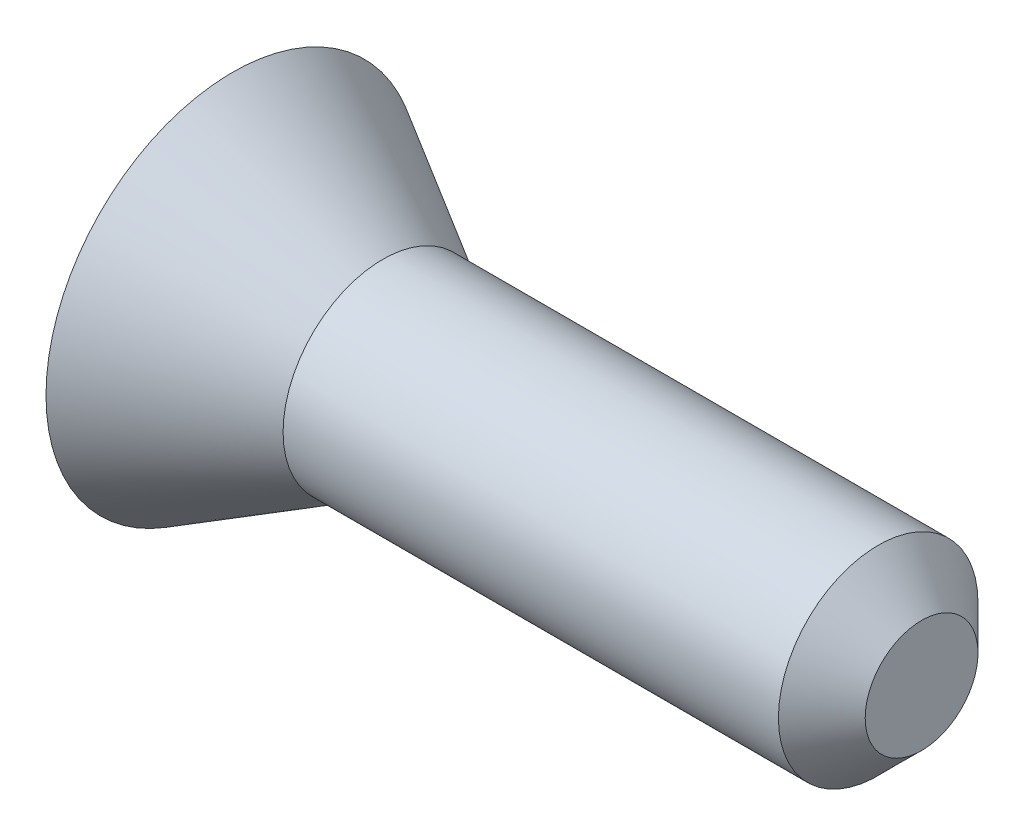
ISO-10303-21;
HEADER;
FILE_DESCRIPTION(('STEP AP214'),'2;1');
FILE_NAME('part.step','',(''),(''),'','','');
FILE_SCHEMA(('AUTOMOTIVE_DESIGN { 1 0 10303 214 1 1 1 1 }'));
ENDSEC;
DATA;
#1=APPLICATION_CONTEXT('core data for automotive mechanical design processes');
#2=APPLICATION_PROTOCOL_DEFINITION('international standard','automotive_design',2000,#1);
#3=PRODUCT_CONTEXT('',#1,'mechanical');
#4=PRODUCT('Part','Part','',(#3));
#5=PRODUCT_RELATED_PRODUCT_CATEGORY('part','',(#4));
#6=PRODUCT_DEFINITION_FORMATION('','',#4);
#7=PRODUCT_DEFINITION_CONTEXT('part definition',#1,'design');
#8=PRODUCT_DEFINITION('design','',#6,#7);
#9=PRODUCT_DEFINITION_SHAPE('','',#8);
#10=(LENGTH_UNIT() NAMED_UNIT(*) SI_UNIT(.MILLI.,.METRE.));
#11=(NAMED_UNIT(*) PLANE_ANGLE_UNIT() SI_UNIT($,.RADIAN.));
#12=(NAMED_UNIT(*) SI_UNIT($,.STERADIAN.) SOLID_ANGLE_UNIT());
#13=UNCERTAINTY_MEASURE_WITH_UNIT(LENGTH_MEASURE(1.E-05),#10,'distance_accuracy_value','');
#14=(GEOMETRIC_REPRESENTATION_CONTEXT(3) GLOBAL_UNCERTAINTY_ASSIGNED_CONTEXT((#13)) GLOBAL_UNIT_ASSIGNED_CONTEXT((#10,
#11,#12)) REPRESENTATION_CONTEXT('',''));
#15=CARTESIAN_POINT('',(0.,0.,0.));
#16=DIRECTION('',(0.,0.,1.));
#17=DIRECTION('',(1.,0.,0.));
#18=AXIS2_PLACEMENT_3D('',#15,#16,#17);
#19=CARTESIAN_POINT('',(0.,-0.3429,1.524));
#20=DIRECTION('',(0.,0.,1.));
#21=DIRECTION('',(1.,0.,0.));
#22=AXIS2_PLACEMENT_3D('',#19,#20,#21);
#23=PLANE('',#22);
#24=DIRECTION('',(1.,0.,0.));
#25=VECTOR('',#24,1.);
#26=CARTESIAN_POINT('',(0.,-0.3429,1.524));
#27=LINE('',#26,#25);
#28=CARTESIAN_POINT('',(1.905,-0.3429,1.524));
#29=VERTEX_POINT('',#28);
#30=CARTESIAN_POINT('',(0.,-0.3429,1.524));
#31=VERTEX_POINT('',#30);
#32=EDGE_CURVE('E117',#29,#31,#27,.F.);
#33=ORIENTED_EDGE('',*,*,#32,.T.);
#34=DIRECTION('',(0.,1.,0.));
#35=VECTOR('',#34,1.);
#36=CARTESIAN_POINT('',(0.,-0.3429,1.524));
#37=LINE('',#36,#35);
#38=CARTESIAN_POINT('',(0.,0.3429,1.524));
#39=VERTEX_POINT('',#38);
#40=EDGE_CURVE('E101',#39,#31,#37,.F.);
#41=ORIENTED_EDGE('',*,*,#40,.F.);
#42=DIRECTION('',(1.,0.,0.));
#43=VECTOR('',#42,1.);
#44=CARTESIAN_POINT('',(0.,0.3429,1.524));
#45=LINE('',#44,#43);
#46=CARTESIAN_POINT('',(1.905,0.3429,1.524));
#47=VERTEX_POINT('',#46);
#48=EDGE_CURVE('E122',#39,#47,#45,.T.);
#49=ORIENTED_EDGE('',*,*,#48,.T.);
#50=DIRECTION('',(0.,1.,0.));
#51=VECTOR('',#50,1.);
#52=CARTESIAN_POINT('',(1.905,-0.3429,1.524));
#53=LINE('',#52,#51);
#54=EDGE_CURVE('E109',#29,#47,#53,.T.);
#55=ORIENTED_EDGE('',*,*,#54,.F.);
#56=EDGE_LOOP('',(#33,#41,#49,#55));
#57=FACE_BOUND('',#56,.T.);
#58=ADVANCED_FACE('F17',(#57),#23,.F.);
#59=CARTESIAN_POINT('',(0.,-0.3429,-1.524));
#60=DIRECTION('',(0.,-1.,0.));
#61=DIRECTION('',(0.,0.,-1.));
#62=AXIS2_PLACEMENT_3D('',#59,#60,#61);
#63=PLANE('',#62);
#64=DIRECTION('',(0.,0.,-1.));
#65=VECTOR('',#64,1.);
#66=CARTESIAN_POINT('',(0.,-0.3429,-1.524));
#67=LINE('',#66,#65);
#68=CARTESIAN_POINT('',(0.,-0.3429,0.3429));
#69=VERTEX_POINT('',#68);
#70=EDGE_CURVE('E126',#31,#69,#67,.T.);
#71=ORIENTED_EDGE('',*,*,#70,.F.);
#72=ORIENTED_EDGE('',*,*,#32,.F.);
#73=DIRECTION('',(0.,0.,-1.));
#74=VECTOR('',#73,1.);
#75=CARTESIAN_POINT('',(1.905,-0.3429,-1.524));
#76=LINE('',#75,#74);
#77=CARTESIAN_POINT('',(1.905,-0.3429,0.3429));
#78=VERTEX_POINT('',#77);
#79=EDGE_CURVE('E106',#78,#29,#76,.F.);
#80=ORIENTED_EDGE('',*,*,#79,.F.);
#81=DIRECTION('',(1.,0.,0.));
#82=VECTOR('',#81,1.);
#83=CARTESIAN_POINT('',(0.,-0.3429,0.3429));
#84=LINE('',#83,#82);
#85=EDGE_CURVE('E201',#78,#69,#84,.F.);
#86=ORIENTED_EDGE('',*,*,#85,.T.);
#87=EDGE_LOOP('',(#71,#72,#80,#86));
#88=FACE_BOUND('',#87,.T.);
#89=ADVANCED_FACE('F125',(#88),#63,.F.);
#90=CARTESIAN_POINT('',(0.,0.3429,1.524));
#91=DIRECTION('',(0.,1.,0.));
#92=DIRECTION('',(0.,0.,1.));
#93=AXIS2_PLACEMENT_3D('',#90,#91,#92);
#94=PLANE('',#93);
#95=DIRECTION('',(0.,0.,1.));
#96=VECTOR('',#95,1.);
#97=CARTESIAN_POINT('',(1.905,0.3429,1.524));
#98=LINE('',#97,#96);
#99=CARTESIAN_POINT('',(1.905,0.3429,0.3429));
#100=VERTEX_POINT('',#99);
#101=EDGE_CURVE('E206',#47,#100,#98,.F.);
#102=ORIENTED_EDGE('',*,*,#101,.F.);
#103=ORIENTED_EDGE('',*,*,#48,.F.);
#104=DIRECTION('',(0.,0.,1.));
#105=VECTOR('',#104,1.);
#106=CARTESIAN_POINT('',(0.,0.3429,1.524));
#107=LINE('',#106,#105);
#108=CARTESIAN_POINT('',(0.,0.3429,0.3429));
#109=VERTEX_POINT('',#108);
#110=EDGE_CURVE('E128',#109,#39,#107,.T.);
#111=ORIENTED_EDGE('',*,*,#110,.F.);
#112=DIRECTION('',(1.,0.,0.));
#113=VECTOR('',#112,1.);
#114=CARTESIAN_POINT('',(0.,0.3429,0.3429));
#115=LINE('',#114,#113);
#116=EDGE_CURVE('E194',#109,#100,#115,.T.);
#117=ORIENTED_EDGE('',*,*,#116,.T.);
#118=EDGE_LOOP('',(#102,#103,#111,#117));
#119=FACE_BOUND('',#118,.T.);
#120=ADVANCED_FACE('F214',(#119),#94,.F.);
#121=CARTESIAN_POINT('',(0.,-1.524,0.3429));
#122=DIRECTION('',(0.,0.,1.));
#123=DIRECTION('',(1.,0.,0.));
#124=AXIS2_PLACEMENT_3D('',#121,#122,#123);
#125=PLANE('',#124);
#126=DIRECTION('',(0.,1.,0.));
#127=VECTOR('',#126,1.);
#128=CARTESIAN_POINT('',(1.905,-1.524,0.3429));
#129=LINE('',#128,#127);
#130=CARTESIAN_POINT('',(1.905,-1.524,0.3429));
#131=VERTEX_POINT('',#130);
#132=EDGE_CURVE('E112',#131,#78,#129,.T.);
#133=ORIENTED_EDGE('',*,*,#132,.F.);
#134=DIRECTION('',(1.,0.,0.));
#135=VECTOR('',#134,1.);
#136=CARTESIAN_POINT('',(0.,-1.524,0.3429));
#137=LINE('',#136,#135);
#138=CARTESIAN_POINT('',(0.,-1.524,0.3429));
#139=VERTEX_POINT('',#138);
#140=EDGE_CURVE('E191',#131,#139,#137,.F.);
#141=ORIENTED_EDGE('',*,*,#140,.T.);
#142=DIRECTION('',(0.,1.,0.));
#143=VECTOR('',#142,1.);
#144=CARTESIAN_POINT('',(0.,-1.524,0.3429));
#145=LINE('',#144,#143);
#146=EDGE_CURVE('E204',#69,#139,#145,.F.);
#147=ORIENTED_EDGE('',*,*,#146,.F.);
#148=ORIENTED_EDGE('',*,*,#85,.F.);
#149=EDGE_LOOP('',(#133,#141,#147,#148));
#150=FACE_BOUND('',#149,.T.);
#151=ADVANCED_FACE('F251',(#150),#125,.F.);
#152=CARTESIAN_POINT('',(0.,-1.524,0.3429));
#153=DIRECTION('',(0.,0.,1.));
#154=DIRECTION('',(1.,0.,0.));
#155=AXIS2_PLACEMENT_3D('',#152,#153,#154);
#156=PLANE('',#155);
#157=DIRECTION('',(0.,1.,0.));
#158=VECTOR('',#157,1.);
#159=CARTESIAN_POINT('',(0.,-1.524,0.3429));
#160=LINE('',#159,#158);
#161=CARTESIAN_POINT('',(0.,1.524,0.3429));
#162=VERTEX_POINT('',#161);
#163=EDGE_CURVE('E197',#162,#109,#160,.F.);
#164=ORIENTED_EDGE('',*,*,#163,.F.);
#165=DIRECTION('',(1.,0.,0.));
#166=VECTOR('',#165,1.);
#167=CARTESIAN_POINT('',(0.,1.524,0.3429));
#168=LINE('',#167,#166);
#169=CARTESIAN_POINT('',(1.905,1.524,0.3429));
#170=VERTEX_POINT('',#169);
#171=EDGE_CURVE('E182',#162,#170,#168,.T.);
#172=ORIENTED_EDGE('',*,*,#171,.T.);
#173=DIRECTION('',(0.,1.,0.));
#174=VECTOR('',#173,1.);
#175=CARTESIAN_POINT('',(1.905,-1.524,0.3429));
#176=LINE('',#175,#174);
#177=EDGE_CURVE('E199',#100,#170,#176,.T.);
#178=ORIENTED_EDGE('',*,*,#177,.F.);
#179=ORIENTED_EDGE('',*,*,#116,.F.);
#180=EDGE_LOOP('',(#164,#172,#178,#179));
#181=FACE_BOUND('',#180,.T.);
#182=ADVANCED_FACE('F219',(#181),#156,.F.);
#183=CARTESIAN_POINT('',(0.,-1.524,-0.3429));
#184=DIRECTION('',(0.,-1.,0.));
#185=DIRECTION('',(0.,0.,-1.));
#186=AXIS2_PLACEMENT_3D('',#183,#184,#185);
#187=PLANE('',#186);
#188=DIRECTION('',(-1.,0.,0.));
#189=VECTOR('',#188,1.);
#190=CARTESIAN_POINT('',(0.,-1.524,-0.3429));
#191=LINE('',#190,#189);
#192=CARTESIAN_POINT('',(1.905,-1.524,-0.3429));
#193=VERTEX_POINT('',#192);
#194=CARTESIAN_POINT('',(0.,-1.524,-0.3429));
#195=VERTEX_POINT('',#194);
#196=EDGE_CURVE('E175',#193,#195,#191,.T.);
#197=ORIENTED_EDGE('',*,*,#196,.T.);
#198=DIRECTION('',(0.,0.,-1.));
#199=VECTOR('',#198,1.);
#200=CARTESIAN_POINT('',(0.,-1.524,-0.3429));
#201=LINE('',#200,#199);
#202=EDGE_CURVE('E189',#139,#195,#201,.T.);
#203=ORIENTED_EDGE('',*,*,#202,.F.);
#204=ORIENTED_EDGE('',*,*,#140,.F.);
#205=DIRECTION('',(0.,0.,-1.));
#206=VECTOR('',#205,1.);
#207=CARTESIAN_POINT('',(1.905,-1.524,-0.3429));
#208=LINE('',#207,#206);
#209=EDGE_CURVE('E187',#193,#131,#208,.F.);
#210=ORIENTED_EDGE('',*,*,#209,.F.);
#211=EDGE_LOOP('',(#197,#203,#204,#210));
#212=FACE_BOUND('',#211,.T.);
#213=ADVANCED_FACE('F245',(#212),#187,.F.);
#214=CARTESIAN_POINT('',(0.,1.524,0.3429));
#215=DIRECTION('',(0.,1.,0.));
#216=DIRECTION('',(0.,0.,1.));
#217=AXIS2_PLACEMENT_3D('',#214,#215,#216);
#218=PLANE('',#217);
#219=ORIENTED_EDGE('',*,*,#171,.F.);
#220=DIRECTION('',(0.,0.,1.));
#221=VECTOR('',#220,1.);
#222=CARTESIAN_POINT('',(0.,1.524,0.3429));
#223=LINE('',#222,#221);
#224=CARTESIAN_POINT('',(0.,1.524,-0.3429));
#225=VERTEX_POINT('',#224);
#226=EDGE_CURVE('E185',#225,#162,#223,.T.);
#227=ORIENTED_EDGE('',*,*,#226,.F.);
#228=DIRECTION('',(-1.,0.,0.));
#229=VECTOR('',#228,1.);
#230=CARTESIAN_POINT('',(0.,1.524,-0.3429));
#231=LINE('',#230,#229);
#232=CARTESIAN_POINT('',(1.905,1.524,-0.3429));
#233=VERTEX_POINT('',#232);
#234=EDGE_CURVE('E168',#225,#233,#231,.F.);
#235=ORIENTED_EDGE('',*,*,#234,.T.);
#236=DIRECTION('',(0.,0.,1.));
#237=VECTOR('',#236,1.);
#238=CARTESIAN_POINT('',(1.905,1.524,0.3429));
#239=LINE('',#238,#237);
#240=EDGE_CURVE('E180',#170,#233,#239,.F.);
#241=ORIENTED_EDGE('',*,*,#240,.F.);
#242=EDGE_LOOP('',(#219,#227,#235,#241));
#243=FACE_BOUND('',#242,.T.);
#244=ADVANCED_FACE('F222',(#243),#218,.F.);
#245=CARTESIAN_POINT('',(0.,1.524,-0.3429));
#246=DIRECTION('',(0.,0.,-1.));
#247=DIRECTION('',(-1.,0.,0.));
#248=AXIS2_PLACEMENT_3D('',#245,#246,#247);
#249=PLANE('',#248);
#250=DIRECTION('',(0.,1.,0.));
#251=VECTOR('',#250,1.);
#252=CARTESIAN_POINT('',(0.,1.524,-0.3429));
#253=LINE('',#252,#251);
#254=CARTESIAN_POINT('',(0.,-0.3429,-0.3429));
#255=VERTEX_POINT('',#254);
#256=EDGE_CURVE('E173',#195,#255,#253,.T.);
#257=ORIENTED_EDGE('',*,*,#256,.F.);
#258=ORIENTED_EDGE('',*,*,#196,.F.);
#259=DIRECTION('',(0.,1.,0.));
#260=VECTOR('',#259,1.);
#261=CARTESIAN_POINT('',(1.905,1.524,-0.3429));
#262=LINE('',#261,#260);
#263=CARTESIAN_POINT('',(1.905,-0.3429,-0.3429));
#264=VERTEX_POINT('',#263);
#265=EDGE_CURVE('E178',#264,#193,#262,.F.);
#266=ORIENTED_EDGE('',*,*,#265,.F.);
#267=DIRECTION('',(1.,0.,0.));
#268=VECTOR('',#267,1.);
#269=CARTESIAN_POINT('',(0.,-0.3429,-0.3429));
#270=LINE('',#269,#268);
#271=EDGE_CURVE('E162',#264,#255,#270,.F.);
#272=ORIENTED_EDGE('',*,*,#271,.T.);
#273=EDGE_LOOP('',(#257,#258,#266,#272));
#274=FACE_BOUND('',#273,.T.);
#275=ADVANCED_FACE('F248',(#274),#249,.F.);
#276=CARTESIAN_POINT('',(0.,1.524,-0.3429));
#277=DIRECTION('',(0.,0.,-1.));
#278=DIRECTION('',(-1.,0.,0.));
#279=AXIS2_PLACEMENT_3D('',#276,#277,#278);
#280=PLANE('',#279);
#281=DIRECTION('',(0.,1.,0.));
#282=VECTOR('',#281,1.);
#283=CARTESIAN_POINT('',(1.905,1.524,-0.3429));
#284=LINE('',#283,#282);
#285=CARTESIAN_POINT('',(1.905,0.3429,-0.3429));
#286=VERTEX_POINT('',#285);
#287=EDGE_CURVE('E166',#233,#286,#284,.F.);
#288=ORIENTED_EDGE('',*,*,#287,.F.);
#289=ORIENTED_EDGE('',*,*,#234,.F.);
#290=DIRECTION('',(0.,1.,0.));
#291=VECTOR('',#290,1.);
#292=CARTESIAN_POINT('',(0.,1.524,-0.3429));
#293=LINE('',#292,#291);
#294=CARTESIAN_POINT('',(0.,0.3429,-0.3429));
#295=VERTEX_POINT('',#294);
#296=EDGE_CURVE('E171',#295,#225,#293,.T.);
#297=ORIENTED_EDGE('',*,*,#296,.F.);
#298=DIRECTION('',(1.,0.,0.));
#299=VECTOR('',#298,1.);
#300=CARTESIAN_POINT('',(0.,0.3429,-0.3429));
#301=LINE('',#300,#299);
#302=EDGE_CURVE('E157',#295,#286,#301,.T.);
#303=ORIENTED_EDGE('',*,*,#302,.T.);
#304=EDGE_LOOP('',(#288,#289,#297,#303));
#305=FACE_BOUND('',#304,.T.);
#306=ADVANCED_FACE('F227',(#305),#280,.F.);
#307=CARTESIAN_POINT('',(0.,-0.3429,-1.524));
#308=DIRECTION('',(0.,-1.,0.));
#309=DIRECTION('',(0.,0.,-1.));
#310=AXIS2_PLACEMENT_3D('',#307,#308,#309);
#311=PLANE('',#310);
#312=DIRECTION('',(0.,0.,-1.));
#313=VECTOR('',#312,1.);
#314=CARTESIAN_POINT('',(1.905,-0.3429,0.));
#315=LINE('',#314,#313);
#316=CARTESIAN_POINT('',(1.905,-0.3429,-1.524));
#317=VERTEX_POINT('',#316);
#318=EDGE_CURVE('E155',#264,#317,#315,.T.);
#319=ORIENTED_EDGE('',*,*,#318,.T.);
#320=DIRECTION('',(-1.,0.,0.));
#321=VECTOR('',#320,1.);
#322=CARTESIAN_POINT('',(0.,-0.3429,-1.524));
#323=LINE('',#322,#321);
#324=CARTESIAN_POINT('',(0.,-0.3429,-1.524));
#325=VERTEX_POINT('',#324);
#326=EDGE_CURVE('E150',#317,#325,#323,.T.);
#327=ORIENTED_EDGE('',*,*,#326,.T.);
#328=DIRECTION('',(0.,0.,-1.));
#329=VECTOR('',#328,1.);
#330=CARTESIAN_POINT('',(0.,-0.3429,-1.524));
#331=LINE('',#330,#329);
#332=EDGE_CURVE('E35',#255,#325,#331,.T.);
#333=ORIENTED_EDGE('',*,*,#332,.F.);
#334=ORIENTED_EDGE('',*,*,#271,.F.);
#335=EDGE_LOOP('',(#319,#327,#333,#334));
#336=FACE_BOUND('',#335,.T.);
#337=ADVANCED_FACE('F238',(#336),#311,.F.);
#338=CARTESIAN_POINT('',(0.,0.3429,1.524));
#339=DIRECTION('',(0.,1.,0.));
#340=DIRECTION('',(0.,0.,1.));
#341=AXIS2_PLACEMENT_3D('',#338,#339,#340);
#342=PLANE('',#341);
#343=DIRECTION('',(0.,0.,1.));
#344=VECTOR('',#343,1.);
#345=CARTESIAN_POINT('',(0.,0.3429,1.524));
#346=LINE('',#345,#344);
#347=CARTESIAN_POINT('',(0.,0.3429,-1.524));
#348=VERTEX_POINT('',#347);
#349=EDGE_CURVE('E160',#348,#295,#346,.T.);
#350=ORIENTED_EDGE('',*,*,#349,.F.);
#351=DIRECTION('',(-1.,0.,0.));
#352=VECTOR('',#351,1.);
#353=CARTESIAN_POINT('',(0.,0.3429,-1.524));
#354=LINE('',#353,#352);
#355=CARTESIAN_POINT('',(1.905,0.3429,-1.524));
#356=VERTEX_POINT('',#355);
#357=EDGE_CURVE('E146',#348,#356,#354,.F.);
#358=ORIENTED_EDGE('',*,*,#357,.T.);
#359=DIRECTION('',(0.,0.,-1.));
#360=VECTOR('',#359,1.);
#361=CARTESIAN_POINT('',(1.905,0.3429,0.));
#362=LINE('',#361,#360);
#363=EDGE_CURVE('E152',#356,#286,#362,.F.);
#364=ORIENTED_EDGE('',*,*,#363,.T.);
#365=ORIENTED_EDGE('',*,*,#302,.F.);
#366=EDGE_LOOP('',(#350,#358,#364,#365));
#367=FACE_BOUND('',#366,.T.);
#368=ADVANCED_FACE('F286',(#367),#342,.F.);
#369=CARTESIAN_POINT('',(1.905,0.,0.));
#370=DIRECTION('',(1.,0.,0.));
#371=DIRECTION('',(0.,0.,-1.));
#372=AXIS2_PLACEMENT_3D('',#369,#370,#371);
#373=PLANE('',#372);
#374=ORIENTED_EDGE('',*,*,#240,.T.);
#375=ORIENTED_EDGE('',*,*,#287,.T.);
#376=ORIENTED_EDGE('',*,*,#363,.F.);
#377=DIRECTION('',(0.,1.,0.));
#378=VECTOR('',#377,1.);
#379=CARTESIAN_POINT('',(1.905,0.3429,-1.524));
#380=LINE('',#379,#378);
#381=EDGE_CURVE('E142',#356,#317,#380,.F.);
#382=ORIENTED_EDGE('',*,*,#381,.T.);
#383=ORIENTED_EDGE('',*,*,#318,.F.);
#384=ORIENTED_EDGE('',*,*,#265,.T.);
#385=ORIENTED_EDGE('',*,*,#209,.T.);
#386=ORIENTED_EDGE('',*,*,#132,.T.);
#387=ORIENTED_EDGE('',*,*,#79,.T.);
#388=ORIENTED_EDGE('',*,*,#54,.T.);
#389=ORIENTED_EDGE('',*,*,#101,.T.);
#390=ORIENTED_EDGE('',*,*,#177,.T.);
#391=EDGE_LOOP('',(#374,#375,#376,#382,#383,#384,#385,#386,#387,#388,#389,#390));
#392=FACE_BOUND('',#391,.T.);
#393=ADVANCED_FACE('F108',(#392),#373,.F.);
#394=CARTESIAN_POINT('',(0.,0.3429,-1.524));
#395=DIRECTION('',(0.,0.,-1.));
#396=DIRECTION('',(-1.,0.,0.));
#397=AXIS2_PLACEMENT_3D('',#394,#395,#396);
#398=PLANE('',#397);
#399=ORIENTED_EDGE('',*,*,#357,.F.);
#400=DIRECTION('',(0.,1.,0.));
#401=VECTOR('',#400,1.);
#402=CARTESIAN_POINT('',(0.,1.36525,-1.524));
#403=LINE('',#402,#401);
#404=EDGE_CURVE('E139',#325,#348,#403,.T.);
#405=ORIENTED_EDGE('',*,*,#404,.F.);
#406=ORIENTED_EDGE('',*,*,#326,.F.);
#407=ORIENTED_EDGE('',*,*,#381,.F.);
#408=EDGE_LOOP('',(#399,#405,#406,#407));
#409=FACE_BOUND('',#408,.T.);
#410=ADVANCED_FACE('F236',(#409),#398,.F.);
#411=CARTESIAN_POINT('',(0.,1.36525,0.));
#412=DIRECTION('',(-1.,0.,0.));
#413=DIRECTION('',(0.,0.,1.));
#414=AXIS2_PLACEMENT_3D('',#411,#412,#413);
#415=PLANE('',#414);
#416=ORIENTED_EDGE('',*,*,#332,.T.);
#417=ORIENTED_EDGE('',*,*,#404,.T.);
#418=ORIENTED_EDGE('',*,*,#349,.T.);
#419=ORIENTED_EDGE('',*,*,#296,.T.);
#420=ORIENTED_EDGE('',*,*,#226,.T.);
#421=ORIENTED_EDGE('',*,*,#163,.T.);
#422=ORIENTED_EDGE('',*,*,#110,.T.);
#423=ORIENTED_EDGE('',*,*,#40,.T.);
#424=ORIENTED_EDGE('',*,*,#70,.T.);
#425=ORIENTED_EDGE('',*,*,#146,.T.);
#426=ORIENTED_EDGE('',*,*,#202,.T.);
#427=ORIENTED_EDGE('',*,*,#256,.T.);
#428=EDGE_LOOP('',(#416,#417,#418,#419,#420,#421,#422,#423,#424,#425,#426,#427));
#429=FACE_BOUND('',#428,.T.);
#430=CARTESIAN_POINT('',(-3.97903932025656E-10,0.,0.));
#431=DIRECTION('',(-1.,0.,0.));
#432=DIRECTION('',(0.,0.,1.));
#433=AXIS2_PLACEMENT_3D('',#430,#431,#432);
#434=CIRCLE('',#433,2.73049999935893);
#435=CARTESIAN_POINT('',(-3.97903932025656E-10,0.,2.73049999935893));
#436=VERTEX_POINT('',#435);
#437=EDGE_CURVE('E20',#436,#436,#434,.F.);
#438=ORIENTED_EDGE('',*,*,#437,.F.);
#439=EDGE_LOOP('',(#438));
#440=FACE_BOUND('',#439,.T.);
#441=ADVANCED_FACE('F209',(#429,#440),#415,.T.);
#442=CARTESIAN_POINT('',(10.0838,0.73025,0.));
#443=DIRECTION('',(1.,0.,0.));
#444=DIRECTION('',(0.,0.,-1.));
#445=AXIS2_PLACEMENT_3D('',#442,#443,#444);
#446=PLANE('',#445);
#447=CARTESIAN_POINT('',(10.0838000003023,0.,0.));
#448=DIRECTION('',(-1.,0.,0.));
#449=DIRECTION('',(0.,0.,1.));
#450=AXIS2_PLACEMENT_3D('',#447,#448,#449);
#451=CIRCLE('',#450,0.825500000246393);
#452=CARTESIAN_POINT('',(10.0838000003023,0.,0.825500000246393));
#453=VERTEX_POINT('',#452);
#454=EDGE_CURVE('E132',#453,#453,#451,.T.);
#455=ORIENTED_EDGE('',*,*,#454,.F.);
#456=EDGE_LOOP('',(#455));
#457=FACE_BOUND('',#456,.T.);
#458=ADVANCED_FACE('F276',(#457),#446,.T.);
#459=CARTESIAN_POINT('',(-3.97903932025656E-10,0.,0.));
#460=DIRECTION('',(-1.,0.,0.));
#461=DIRECTION('',(0.,0.,1.));
#462=AXIS2_PLACEMENT_3D('',#459,#460,#461);
#463=CONICAL_SURFACE('',#462,2.73049999935893,0.52359877500272);
#464=ORIENTED_EDGE('',*,*,#437,.T.);
#465=EDGE_LOOP('',(#464));
#466=FACE_BOUND('',#465,.T.);
#467=CARTESIAN_POINT('',(2.19970452561248,0.,0.));
#468=DIRECTION('',(1.,0.,0.));
#469=DIRECTION('',(0.,0.,-1.));
#470=AXIS2_PLACEMENT_3D('',#467,#468,#469);
#471=CIRCLE('',#470,1.4605);
#472=CARTESIAN_POINT('',(2.19970452561248,0.,-1.4605));
#473=VERTEX_POINT('',#472);
#474=EDGE_CURVE('E26',#473,#473,#471,.T.);
#475=ORIENTED_EDGE('',*,*,#474,.F.);
#476=EDGE_LOOP('',(#475));
#477=FACE_BOUND('',#476,.T.);
#478=ADVANCED_FACE('F269',(#466,#477),#463,.T.);
#479=CARTESIAN_POINT('',(9.44879999974546,0.,0.));
#480=DIRECTION('',(-1.,0.,0.));
#481=DIRECTION('',(0.,0.,1.));
#482=AXIS2_PLACEMENT_3D('',#479,#480,#481);
#483=CONICAL_SURFACE('',#482,1.46049999966635,0.785398162502276);
#484=CARTESIAN_POINT('',(9.4488,0.,0.));
#485=DIRECTION('',(1.,0.,0.));
#486=DIRECTION('',(0.,0.,-1.));
#487=AXIS2_PLACEMENT_3D('',#484,#485,#486);
#488=CIRCLE('',#487,1.4605);
#489=CARTESIAN_POINT('',(9.4488,0.,-1.4605));
#490=VERTEX_POINT('',#489);
#491=EDGE_CURVE('E11',#490,#490,#488,.F.);
#492=ORIENTED_EDGE('',*,*,#491,.F.);
#493=EDGE_LOOP('',(#492));
#494=FACE_BOUND('',#493,.T.);
#495=ORIENTED_EDGE('',*,*,#454,.T.);
#496=EDGE_LOOP('',(#495));
#497=FACE_BOUND('',#496,.T.);
#498=ADVANCED_FACE('F263',(#494,#497),#483,.T.);
#499=CARTESIAN_POINT('',(6.14175226280624,0.,0.));
#500=DIRECTION('',(1.,0.,0.));
#501=DIRECTION('',(0.,0.,-1.));
#502=AXIS2_PLACEMENT_3D('',#499,#500,#501);
#503=CYLINDRICAL_SURFACE('',#502,1.4605);
#504=ORIENTED_EDGE('',*,*,#474,.T.);
#505=EDGE_LOOP('',(#504));
#506=FACE_BOUND('',#505,.T.);
#507=ORIENTED_EDGE('',*,*,#491,.T.);
#508=EDGE_LOOP('',(#507));
#509=FACE_BOUND('',#508,.T.);
#510=ADVANCED_FACE('F261',(#506,#509),#503,.T.);
#511=CLOSED_SHELL('',(#58,#89,#120,#151,#182,#213,#244,#275,#306,#337,#368,#393,#410,#441,#458,
#478,#498,#510));
#512=MANIFOLD_SOLID_BREP('B1',#511);
#513=ADVANCED_BREP_SHAPE_REPRESENTATION('',(#18,#512),#14);
#514=SHAPE_DEFINITION_REPRESENTATION(#9,#513);
ENDSEC;
END-ISO-10303-21;
